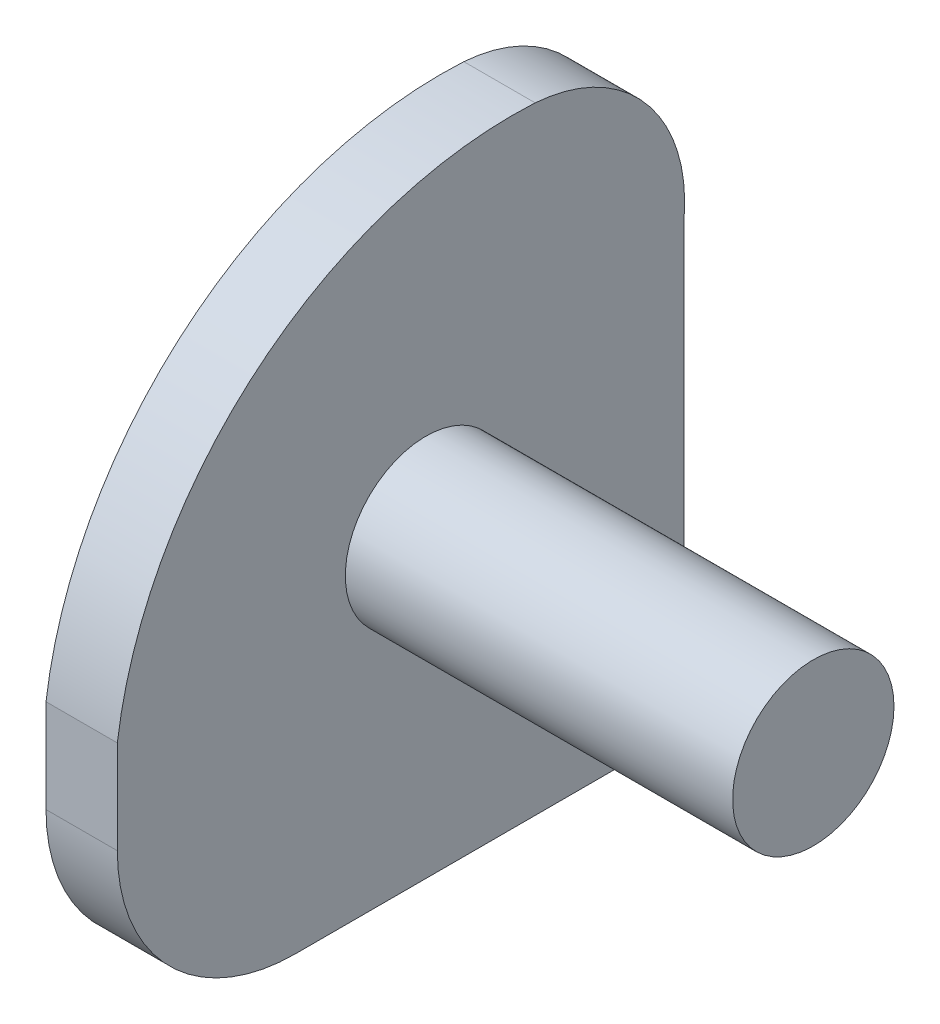
ISO-10303-21;
HEADER;
FILE_DESCRIPTION(('STEP AP214'),'2;1');
FILE_NAME('part.step','',(''),(''),'','','');
FILE_SCHEMA(('AUTOMOTIVE_DESIGN { 1 0 10303 214 1 1 1 1 }'));
ENDSEC;
DATA;
#1=APPLICATION_CONTEXT('core data for automotive mechanical design processes');
#2=APPLICATION_PROTOCOL_DEFINITION('international standard','automotive_design',2000,#1);
#3=PRODUCT_CONTEXT('',#1,'mechanical');
#4=PRODUCT('Part','Part','',(#3));
#5=PRODUCT_RELATED_PRODUCT_CATEGORY('part','',(#4));
#6=PRODUCT_DEFINITION_FORMATION('','',#4);
#7=PRODUCT_DEFINITION_CONTEXT('part definition',#1,'design');
#8=PRODUCT_DEFINITION('design','',#6,#7);
#9=PRODUCT_DEFINITION_SHAPE('','',#8);
#10=(LENGTH_UNIT() NAMED_UNIT(*) SI_UNIT(.MILLI.,.METRE.));
#11=(NAMED_UNIT(*) PLANE_ANGLE_UNIT() SI_UNIT($,.RADIAN.));
#12=(NAMED_UNIT(*) SI_UNIT($,.STERADIAN.) SOLID_ANGLE_UNIT());
#13=UNCERTAINTY_MEASURE_WITH_UNIT(LENGTH_MEASURE(1.E-05),#10,'distance_accuracy_value','');
#14=(GEOMETRIC_REPRESENTATION_CONTEXT(3) GLOBAL_UNCERTAINTY_ASSIGNED_CONTEXT((#13)) GLOBAL_UNIT_ASSIGNED_CONTEXT((#10,
#11,#12)) REPRESENTATION_CONTEXT('',''));
#15=CARTESIAN_POINT('',(0.,0.,0.));
#16=DIRECTION('',(0.,0.,1.));
#17=DIRECTION('',(1.,0.,0.));
#18=AXIS2_PLACEMENT_3D('',#15,#16,#17);
#19=CARTESIAN_POINT('',(11.10510806,-59.1327952518653,-81.4623727356959));
#20=DIRECTION('',(-1.,0.,0.));
#21=DIRECTION('',(0.,0.,1.));
#22=AXIS2_PLACEMENT_3D('',#19,#20,#21);
#23=CYLINDRICAL_SURFACE('',#22,5.5255403);
#24=CARTESIAN_POINT('',(8.89489194,-59.1327952518653,-81.4623727356959));
#25=DIRECTION('',(1.,0.,0.));
#26=DIRECTION('',(0.,0.,-1.));
#27=AXIS2_PLACEMENT_3D('',#24,#25,#26);
#28=CIRCLE('',#27,5.5255403);
#29=CARTESIAN_POINT('',(8.89489194,-59.1327952518653,-75.9368324356958));
#30=VERTEX_POINT('',#29);
#31=CARTESIAN_POINT('',(8.89489194,-64.6583355518653,-81.4623727356959));
#32=VERTEX_POINT('',#31);
#33=EDGE_CURVE('E136',#30,#32,#28,.T.);
#34=ORIENTED_EDGE('',*,*,#33,.T.);
#35=DIRECTION('',(-1.,0.,0.));
#36=VECTOR('',#35,1.);
#37=CARTESIAN_POINT('',(11.10510806,-64.6583355518653,-81.4623727356959));
#38=LINE('',#37,#36);
#39=CARTESIAN_POINT('',(11.10510806,-64.6583355518653,-81.4623727356959));
#40=VERTEX_POINT('',#39);
#41=EDGE_CURVE('E44',#40,#32,#38,.T.);
#42=ORIENTED_EDGE('',*,*,#41,.F.);
#43=CARTESIAN_POINT('',(11.10510806,-59.1327952518653,-81.4623727356959));
#44=DIRECTION('',(1.,0.,0.));
#45=DIRECTION('',(0.,0.,-1.));
#46=AXIS2_PLACEMENT_3D('',#43,#44,#45);
#47=CIRCLE('',#46,5.5255403);
#48=CARTESIAN_POINT('',(11.10510806,-59.1327952518653,-75.9368324356958));
#49=VERTEX_POINT('',#48);
#50=EDGE_CURVE('E158',#49,#40,#47,.T.);
#51=ORIENTED_EDGE('',*,*,#50,.F.);
#52=DIRECTION('',(-1.,0.,0.));
#53=VECTOR('',#52,1.);
#54=CARTESIAN_POINT('',(11.10510806,-59.1327952518653,-75.9368324356958));
#55=LINE('',#54,#53);
#56=EDGE_CURVE('E132',#49,#30,#55,.T.);
#57=ORIENTED_EDGE('',*,*,#56,.T.);
#58=EDGE_LOOP('',(#34,#42,#51,#57));
#59=FACE_BOUND('',#58,.T.);
#60=ADVANCED_FACE('F41',(#59),#23,.T.);
#61=CARTESIAN_POINT('',(11.10510806,-64.6583355518653,-82.4897959575849));
#62=DIRECTION('',(0.,1.,0.));
#63=DIRECTION('',(0.,0.,1.));
#64=AXIS2_PLACEMENT_3D('',#61,#62,#63);
#65=PLANE('',#64);
#66=DIRECTION('',(0.,0.,-1.));
#67=VECTOR('',#66,1.);
#68=CARTESIAN_POINT('',(8.89489194,-64.6583355518653,-82.4897959575849));
#69=LINE('',#68,#67);
#70=CARTESIAN_POINT('',(8.89489194,-64.6583355518653,-91.2910940169464));
#71=VERTEX_POINT('',#70);
#72=EDGE_CURVE('E140',#32,#71,#69,.T.);
#73=ORIENTED_EDGE('',*,*,#72,.T.);
#74=DIRECTION('',(-1.,0.,0.));
#75=VECTOR('',#74,1.);
#76=CARTESIAN_POINT('',(11.10510806,-64.6583355518653,-91.2910940169464));
#77=LINE('',#76,#75);
#78=CARTESIAN_POINT('',(11.10510806,-64.6583355518653,-91.2910940169464));
#79=VERTEX_POINT('',#78);
#80=EDGE_CURVE('E168',#79,#71,#77,.T.);
#81=ORIENTED_EDGE('',*,*,#80,.F.);
#82=DIRECTION('',(0.,0.,-1.));
#83=VECTOR('',#82,1.);
#84=CARTESIAN_POINT('',(11.10510806,-64.6583355518653,-81.4623727356959));
#85=LINE('',#84,#83);
#86=EDGE_CURVE('E96',#40,#79,#85,.T.);
#87=ORIENTED_EDGE('',*,*,#86,.F.);
#88=ORIENTED_EDGE('',*,*,#41,.T.);
#89=EDGE_LOOP('',(#73,#81,#87,#88));
#90=FACE_BOUND('',#89,.T.);
#91=ADVANCED_FACE('F176',(#90),#65,.F.);
#92=CARTESIAN_POINT('',(11.10510806,-62.4481194318653,-91.2910940169464));
#93=DIRECTION('',(-1.,0.,0.));
#94=DIRECTION('',(0.,0.,1.));
#95=AXIS2_PLACEMENT_3D('',#92,#93,#94);
#96=CYLINDRICAL_SURFACE('',#95,2.21021612);
#97=CARTESIAN_POINT('',(8.89489194,-62.4481194318653,-91.2910940169464));
#98=DIRECTION('',(1.,0.,0.));
#99=DIRECTION('',(0.,0.,-1.));
#100=AXIS2_PLACEMENT_3D('',#97,#98,#99);
#101=CIRCLE('',#100,2.21021612);
#102=CARTESIAN_POINT('',(8.89489194,-62.4481194318653,-93.5013101369464));
#103=VERTEX_POINT('',#102);
#104=EDGE_CURVE('E144',#71,#103,#101,.T.);
#105=ORIENTED_EDGE('',*,*,#104,.T.);
#106=DIRECTION('',(-1.,0.,0.));
#107=VECTOR('',#106,1.);
#108=CARTESIAN_POINT('',(11.10510806,-62.4481194318653,-93.5013101369464));
#109=LINE('',#108,#107);
#110=CARTESIAN_POINT('',(11.10510806,-62.4481194318653,-93.5013101369464));
#111=VERTEX_POINT('',#110);
#112=EDGE_CURVE('E165',#111,#103,#109,.T.);
#113=ORIENTED_EDGE('',*,*,#112,.F.);
#114=CARTESIAN_POINT('',(11.10510806,-62.4481194318653,-91.2910940169464));
#115=DIRECTION('',(1.,0.,0.));
#116=DIRECTION('',(0.,0.,-1.));
#117=AXIS2_PLACEMENT_3D('',#114,#115,#116);
#118=CIRCLE('',#117,2.21021612);
#119=EDGE_CURVE('E185',#79,#111,#118,.T.);
#120=ORIENTED_EDGE('',*,*,#119,.F.);
#121=ORIENTED_EDGE('',*,*,#80,.T.);
#122=EDGE_LOOP('',(#105,#113,#120,#121));
#123=FACE_BOUND('',#122,.T.);
#124=ADVANCED_FACE('F184',(#123),#96,.T.);
#125=CARTESIAN_POINT('',(11.10510806,-50.8771478566042,-93.5013101369464));
#126=DIRECTION('',(0.,0.,-1.));
#127=DIRECTION('',(-1.,0.,0.));
#128=AXIS2_PLACEMENT_3D('',#125,#126,#127);
#129=PLANE('',#128);
#130=DIRECTION('',(0.,-1.,0.));
#131=VECTOR('',#130,1.);
#132=CARTESIAN_POINT('',(8.89489194,-50.8771478566042,-93.5013101369464));
#133=LINE('',#132,#131);
#134=CARTESIAN_POINT('',(8.89489194,-50.8771478566042,-93.5013101369464));
#135=VERTEX_POINT('',#134);
#136=EDGE_CURVE('E148',#135,#103,#133,.T.);
#137=ORIENTED_EDGE('',*,*,#136,.F.);
#138=DIRECTION('',(-1.,0.,0.));
#139=VECTOR('',#138,1.);
#140=CARTESIAN_POINT('',(11.10510806,-50.8771478566042,-93.5013101369464));
#141=LINE('',#140,#139);
#142=CARTESIAN_POINT('',(11.10510806,-50.8771478566042,-93.5013101369464));
#143=VERTEX_POINT('',#142);
#144=EDGE_CURVE('E119',#143,#135,#141,.T.);
#145=ORIENTED_EDGE('',*,*,#144,.F.);
#146=DIRECTION('',(0.,-1.,0.));
#147=VECTOR('',#146,1.);
#148=CARTESIAN_POINT('',(11.10510806,-55.1339858609789,-93.5013101369464));
#149=LINE('',#148,#147);
#150=EDGE_CURVE('E124',#143,#111,#149,.T.);
#151=ORIENTED_EDGE('',*,*,#150,.T.);
#152=ORIENTED_EDGE('',*,*,#112,.T.);
#153=EDGE_LOOP('',(#137,#145,#151,#152));
#154=FACE_BOUND('',#153,.T.);
#155=ADVANCED_FACE('F187',(#154),#129,.T.);
#156=CARTESIAN_POINT('',(11.10510806,-50.5164284701532,-88.5231257206878));
#157=DIRECTION('',(-1.,0.,0.));
#158=DIRECTION('',(0.,0.,1.));
#159=AXIS2_PLACEMENT_3D('',#156,#157,#158);
#160=CYLINDRICAL_SURFACE('',#159,4.99123617534191);
#161=CARTESIAN_POINT('',(8.89489194,-50.5164284701532,-88.5231257206878));
#162=DIRECTION('',(-1.,0.,0.));
#163=DIRECTION('',(0.,0.,1.));
#164=AXIS2_PLACEMENT_3D('',#161,#162,#163);
#165=CIRCLE('',#164,4.99123617534191);
#166=CARTESIAN_POINT('',(8.89489194,-45.5382440549704,-88.8838451219861));
#167=VERTEX_POINT('',#166);
#168=EDGE_CURVE('E113',#167,#135,#165,.T.);
#169=ORIENTED_EDGE('',*,*,#168,.F.);
#170=DIRECTION('',(-1.,0.,0.));
#171=VECTOR('',#170,1.);
#172=CARTESIAN_POINT('',(11.10510806,-45.5382440549704,-88.8838451219861));
#173=LINE('',#172,#171);
#174=CARTESIAN_POINT('',(11.10510806,-45.5382440549704,-88.8838451219861));
#175=VERTEX_POINT('',#174);
#176=EDGE_CURVE('E108',#175,#167,#173,.T.);
#177=ORIENTED_EDGE('',*,*,#176,.F.);
#178=CARTESIAN_POINT('',(11.10510806,-50.5164284701532,-88.5231257206878));
#179=DIRECTION('',(-1.,0.,0.));
#180=DIRECTION('',(0.,0.,1.));
#181=AXIS2_PLACEMENT_3D('',#178,#179,#180);
#182=CIRCLE('',#181,4.99123617534191);
#183=EDGE_CURVE('E111',#175,#143,#182,.T.);
#184=ORIENTED_EDGE('',*,*,#183,.T.);
#185=ORIENTED_EDGE('',*,*,#144,.T.);
#186=EDGE_LOOP('',(#169,#177,#184,#185));
#187=FACE_BOUND('',#186,.T.);
#188=ADVANCED_FACE('F110',(#187),#160,.T.);
#189=CARTESIAN_POINT('',(11.10510806,-57.8809764135069,-88.1895585719001));
#190=DIRECTION('',(-1.,0.,0.));
#191=DIRECTION('',(0.,0.,1.));
#192=AXIS2_PLACEMENT_3D('',#189,#190,#191);
#193=CYLINDRICAL_SURFACE('',#192,12.3622439665335);
#194=CARTESIAN_POINT('',(8.89489194,-57.8809764135069,-88.1895585719001));
#195=DIRECTION('',(-1.,0.,0.));
#196=DIRECTION('',(0.,0.,1.));
#197=AXIS2_PLACEMENT_3D('',#194,#195,#196);
#198=CIRCLE('',#197,12.3622439665335);
#199=CARTESIAN_POINT('',(8.89489194,-56.239093920979,-75.9368324356958));
#200=VERTEX_POINT('',#199);
#201=EDGE_CURVE('E153',#200,#167,#198,.T.);
#202=ORIENTED_EDGE('',*,*,#201,.F.);
#203=DIRECTION('',(-1.,0.,0.));
#204=VECTOR('',#203,1.);
#205=CARTESIAN_POINT('',(11.10510806,-56.239093920979,-75.9368324356958));
#206=LINE('',#205,#204);
#207=CARTESIAN_POINT('',(11.10510806,-56.239093920979,-75.9368324356958));
#208=VERTEX_POINT('',#207);
#209=EDGE_CURVE('E84',#208,#200,#206,.T.);
#210=ORIENTED_EDGE('',*,*,#209,.F.);
#211=CARTESIAN_POINT('',(11.10510806,-57.8809764135069,-88.1895585719001));
#212=DIRECTION('',(-1.,0.,0.));
#213=DIRECTION('',(0.,0.,1.));
#214=AXIS2_PLACEMENT_3D('',#211,#212,#213);
#215=CIRCLE('',#214,12.3622439665335);
#216=EDGE_CURVE('E122',#208,#175,#215,.T.);
#217=ORIENTED_EDGE('',*,*,#216,.T.);
#218=ORIENTED_EDGE('',*,*,#176,.T.);
#219=EDGE_LOOP('',(#202,#210,#217,#218));
#220=FACE_BOUND('',#219,.T.);
#221=ADVANCED_FACE('F128',(#220),#193,.T.);
#222=CARTESIAN_POINT('',(11.10510806,-56.239093920979,-75.9368324356958));
#223=DIRECTION('',(0.,0.,-1.));
#224=DIRECTION('',(0.,1.,0.));
#225=AXIS2_PLACEMENT_3D('',#222,#223,#224);
#226=PLANE('',#225);
#227=DIRECTION('',(0.,-1.,0.));
#228=VECTOR('',#227,1.);
#229=CARTESIAN_POINT('',(8.89489194,-56.239093920979,-75.9368324356958));
#230=LINE('',#229,#228);
#231=EDGE_CURVE('E87',#200,#30,#230,.T.);
#232=ORIENTED_EDGE('',*,*,#231,.T.);
#233=ORIENTED_EDGE('',*,*,#56,.F.);
#234=DIRECTION('',(0.,-1.,0.));
#235=VECTOR('',#234,1.);
#236=CARTESIAN_POINT('',(11.10510806,-56.239093920979,-75.9368324356958));
#237=LINE('',#236,#235);
#238=EDGE_CURVE('E59',#208,#49,#237,.T.);
#239=ORIENTED_EDGE('',*,*,#238,.F.);
#240=ORIENTED_EDGE('',*,*,#209,.T.);
#241=EDGE_LOOP('',(#232,#233,#239,#240));
#242=FACE_BOUND('',#241,.T.);
#243=ADVANCED_FACE('F209',(#242),#226,.F.);
#244=CARTESIAN_POINT('',(11.10510806,-59.1327952518653,-81.4623727356959));
#245=DIRECTION('',(1.,0.,0.));
#246=DIRECTION('',(0.,0.,-1.));
#247=AXIS2_PLACEMENT_3D('',#244,#245,#246);
#248=PLANE('',#247);
#249=CARTESIAN_POINT('',(11.10510806,-55.2882440549704,-85.5013101369464));
#250=DIRECTION('',(1.,0.,0.));
#251=DIRECTION('',(0.,0.,-1.));
#252=AXIS2_PLACEMENT_3D('',#249,#250,#251);
#253=CIRCLE('',#252,2.5);
#254=CARTESIAN_POINT('',(11.10510806,-55.2882440549704,-88.0013101369464));
#255=VERTEX_POINT('',#254);
#256=EDGE_CURVE('E11',#255,#255,#253,.T.);
#257=ORIENTED_EDGE('',*,*,#256,.F.);
#258=EDGE_LOOP('',(#257));
#259=FACE_BOUND('',#258,.T.);
#260=ORIENTED_EDGE('',*,*,#50,.T.);
#261=ORIENTED_EDGE('',*,*,#86,.T.);
#262=ORIENTED_EDGE('',*,*,#119,.T.);
#263=ORIENTED_EDGE('',*,*,#150,.F.);
#264=ORIENTED_EDGE('',*,*,#183,.F.);
#265=ORIENTED_EDGE('',*,*,#216,.F.);
#266=ORIENTED_EDGE('',*,*,#238,.T.);
#267=EDGE_LOOP('',(#260,#261,#262,#263,#264,#265,#266));
#268=FACE_BOUND('',#267,.T.);
#269=ADVANCED_FACE('F121',(#259,#268),#248,.T.);
#270=CARTESIAN_POINT('',(8.89489194,-59.1327952518653,-81.4623727356959));
#271=DIRECTION('',(1.,0.,0.));
#272=DIRECTION('',(0.,0.,-1.));
#273=AXIS2_PLACEMENT_3D('',#270,#271,#272);
#274=PLANE('',#273);
#275=ORIENTED_EDGE('',*,*,#33,.F.);
#276=ORIENTED_EDGE('',*,*,#231,.F.);
#277=ORIENTED_EDGE('',*,*,#201,.T.);
#278=ORIENTED_EDGE('',*,*,#168,.T.);
#279=ORIENTED_EDGE('',*,*,#136,.T.);
#280=ORIENTED_EDGE('',*,*,#104,.F.);
#281=ORIENTED_EDGE('',*,*,#72,.F.);
#282=EDGE_LOOP('',(#275,#276,#277,#278,#279,#280,#281));
#283=FACE_BOUND('',#282,.T.);
#284=ADVANCED_FACE('F181',(#283),#274,.F.);
#285=CARTESIAN_POINT('',(23.10510806,-55.2882440549704,-85.5013101369464));
#286=DIRECTION('',(-1.,0.,0.));
#287=DIRECTION('',(0.,0.,1.));
#288=AXIS2_PLACEMENT_3D('',#285,#286,#287);
#289=CYLINDRICAL_SURFACE('',#288,2.5);
#290=CARTESIAN_POINT('',(23.10510806,-55.2882440549704,-85.5013101369464));
#291=DIRECTION('',(1.,0.,0.));
#292=DIRECTION('',(0.,0.,-1.));
#293=AXIS2_PLACEMENT_3D('',#290,#291,#292);
#294=CIRCLE('',#293,2.5);
#295=CARTESIAN_POINT('',(23.10510806,-55.2882440549704,-88.0013101369464));
#296=VERTEX_POINT('',#295);
#297=EDGE_CURVE('E141',#296,#296,#294,.T.);
#298=ORIENTED_EDGE('',*,*,#297,.F.);
#299=EDGE_LOOP('',(#298));
#300=FACE_BOUND('',#299,.T.);
#301=ORIENTED_EDGE('',*,*,#256,.T.);
#302=EDGE_LOOP('',(#301));
#303=FACE_BOUND('',#302,.T.);
#304=ADVANCED_FACE('F202',(#300,#303),#289,.T.);
#305=CARTESIAN_POINT('',(23.10510806,-55.2882440549704,-85.5013101369464));
#306=DIRECTION('',(1.,0.,0.));
#307=DIRECTION('',(0.,0.,-1.));
#308=AXIS2_PLACEMENT_3D('',#305,#306,#307);
#309=PLANE('',#308);
#310=ORIENTED_EDGE('',*,*,#297,.T.);
#311=EDGE_LOOP('',(#310));
#312=FACE_BOUND('',#311,.T.);
#313=ADVANCED_FACE('F200',(#312),#309,.T.);
#314=CLOSED_SHELL('',(#60,#91,#124,#155,#188,#221,#243,#269,#284,#304,#313));
#315=MANIFOLD_SOLID_BREP('B2',#314);
#316=ADVANCED_BREP_SHAPE_REPRESENTATION('',(#18,#315),#14);
#317=SHAPE_DEFINITION_REPRESENTATION(#9,#316);
ENDSEC;
END-ISO-10303-21;
